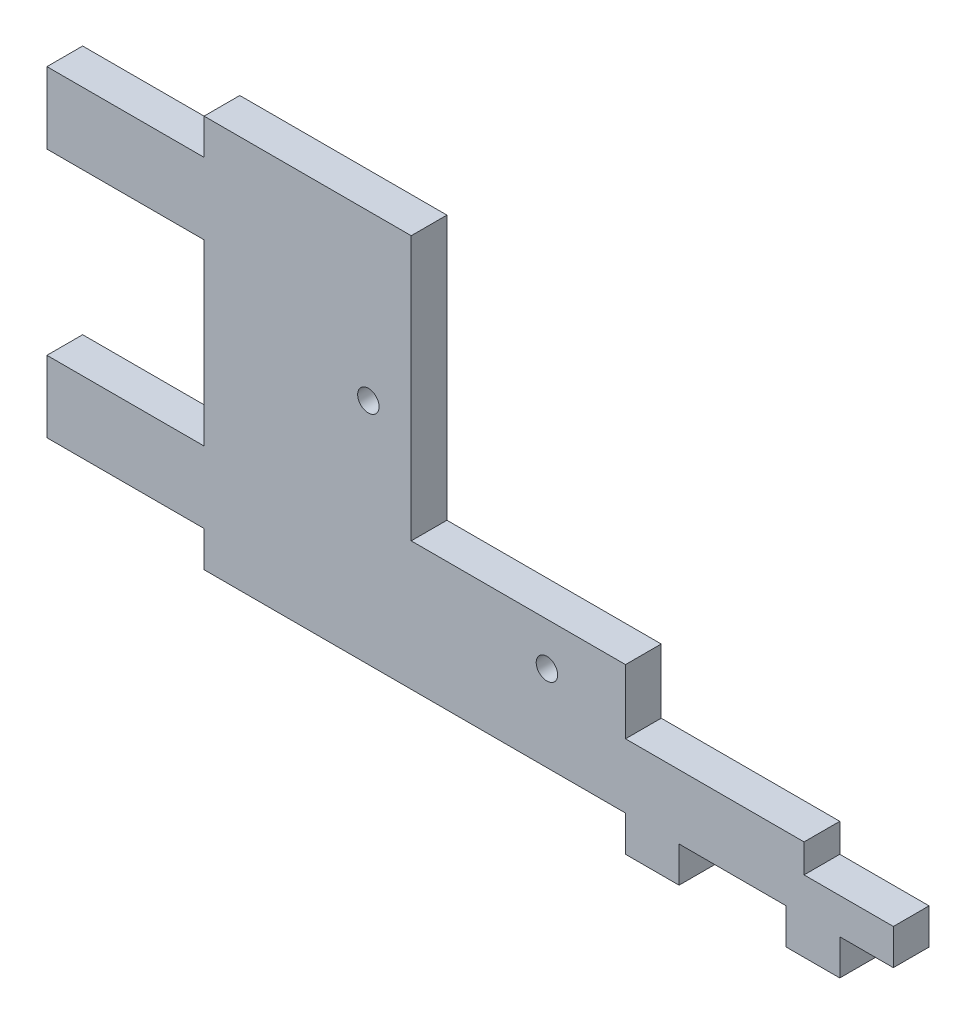
ISO-10303-21;
HEADER;
FILE_DESCRIPTION(('STEP AP214'),'2;1');
FILE_NAME('part.step','',(''),(''),'','','');
FILE_SCHEMA(('AUTOMOTIVE_DESIGN { 1 0 10303 214 1 1 1 1 }'));
ENDSEC;
DATA;
#1=APPLICATION_CONTEXT('core data for automotive mechanical design processes');
#2=APPLICATION_PROTOCOL_DEFINITION('international standard','automotive_design',2000,#1);
#3=PRODUCT_CONTEXT('',#1,'mechanical');
#4=PRODUCT('Part','Part','',(#3));
#5=PRODUCT_RELATED_PRODUCT_CATEGORY('part','',(#4));
#6=PRODUCT_DEFINITION_FORMATION('','',#4);
#7=PRODUCT_DEFINITION_CONTEXT('part definition',#1,'design');
#8=PRODUCT_DEFINITION('design','',#6,#7);
#9=PRODUCT_DEFINITION_SHAPE('','',#8);
#10=(LENGTH_UNIT() NAMED_UNIT(*) SI_UNIT(.MILLI.,.METRE.));
#11=(NAMED_UNIT(*) PLANE_ANGLE_UNIT() SI_UNIT($,.RADIAN.));
#12=(NAMED_UNIT(*) SI_UNIT($,.STERADIAN.) SOLID_ANGLE_UNIT());
#13=UNCERTAINTY_MEASURE_WITH_UNIT(LENGTH_MEASURE(1.E-05),#10,'distance_accuracy_value','');
#14=(GEOMETRIC_REPRESENTATION_CONTEXT(3) GLOBAL_UNCERTAINTY_ASSIGNED_CONTEXT((#13)) GLOBAL_UNIT_ASSIGNED_CONTEXT((#10,
#11,#12)) REPRESENTATION_CONTEXT('',''));
#15=CARTESIAN_POINT('',(0.,0.,0.));
#16=DIRECTION('',(0.,0.,1.));
#17=DIRECTION('',(1.,0.,0.));
#18=AXIS2_PLACEMENT_3D('',#15,#16,#17);
#19=CARTESIAN_POINT('',(0.,0.,5.));
#20=DIRECTION('',(0.,0.,-1.));
#21=DIRECTION('',(-1.,0.,0.));
#22=AXIS2_PLACEMENT_3D('',#19,#20,#21);
#23=PLANE('',#22);
#24=CARTESIAN_POINT('',(6.,32.,5.));
#25=DIRECTION('',(0.,0.,1.));
#26=DIRECTION('',(1.,0.,0.));
#27=AXIS2_PLACEMENT_3D('',#24,#25,#26);
#28=CIRCLE('',#27,1.5);
#29=CARTESIAN_POINT('',(7.5,32.,5.));
#30=VERTEX_POINT('',#29);
#31=EDGE_CURVE('E261',#30,#30,#28,.T.);
#32=ORIENTED_EDGE('',*,*,#31,.F.);
#33=EDGE_LOOP('',(#32));
#34=FACE_BOUND('',#33,.T.);
#35=DIRECTION('',(-1.,0.,0.));
#36=VECTOR('',#35,1.);
#37=CARTESIAN_POINT('',(0.,55.,5.));
#38=LINE('',#37,#36);
#39=CARTESIAN_POINT('',(12.,55.,5.));
#40=VERTEX_POINT('',#39);
#41=CARTESIAN_POINT('',(-17.,55.,5.));
#42=VERTEX_POINT('',#41);
#43=EDGE_CURVE('E271',#40,#42,#38,.T.);
#44=ORIENTED_EDGE('',*,*,#43,.T.);
#45=DIRECTION('',(0.,-1.,0.));
#46=VECTOR('',#45,1.);
#47=CARTESIAN_POINT('',(-17.,50.,5.));
#48=LINE('',#47,#46);
#49=CARTESIAN_POINT('',(-17.,50.,5.));
#50=VERTEX_POINT('',#49);
#51=EDGE_CURVE('E327',#42,#50,#48,.T.);
#52=ORIENTED_EDGE('',*,*,#51,.T.);
#53=DIRECTION('',(-1.,0.,0.));
#54=VECTOR('',#53,1.);
#55=CARTESIAN_POINT('',(-17.,50.,5.));
#56=LINE('',#55,#54);
#57=CARTESIAN_POINT('',(-39.,50.,5.));
#58=VERTEX_POINT('',#57);
#59=EDGE_CURVE('E330',#50,#58,#56,.T.);
#60=ORIENTED_EDGE('',*,*,#59,.T.);
#61=DIRECTION('',(0.,-1.,0.));
#62=VECTOR('',#61,1.);
#63=CARTESIAN_POINT('',(-39.,50.,5.));
#64=LINE('',#63,#62);
#65=CARTESIAN_POINT('',(-39.,40.,5.));
#66=VERTEX_POINT('',#65);
#67=EDGE_CURVE('E333',#58,#66,#64,.T.);
#68=ORIENTED_EDGE('',*,*,#67,.T.);
#69=DIRECTION('',(1.,0.,0.));
#70=VECTOR('',#69,1.);
#71=CARTESIAN_POINT('',(-17.,40.,5.));
#72=LINE('',#71,#70);
#73=CARTESIAN_POINT('',(-17.,40.,5.));
#74=VERTEX_POINT('',#73);
#75=EDGE_CURVE('E336',#66,#74,#72,.T.);
#76=ORIENTED_EDGE('',*,*,#75,.T.);
#77=DIRECTION('',(0.,-1.,0.));
#78=VECTOR('',#77,1.);
#79=CARTESIAN_POINT('',(-17.,15.,5.));
#80=LINE('',#79,#78);
#81=CARTESIAN_POINT('',(-17.,15.,5.));
#82=VERTEX_POINT('',#81);
#83=EDGE_CURVE('E339',#74,#82,#80,.T.);
#84=ORIENTED_EDGE('',*,*,#83,.T.);
#85=DIRECTION('',(-1.,0.,0.));
#86=VECTOR('',#85,1.);
#87=CARTESIAN_POINT('',(-17.,15.,5.));
#88=LINE('',#87,#86);
#89=CARTESIAN_POINT('',(-39.,15.,5.));
#90=VERTEX_POINT('',#89);
#91=EDGE_CURVE('E342',#82,#90,#88,.T.);
#92=ORIENTED_EDGE('',*,*,#91,.T.);
#93=DIRECTION('',(0.,-1.,0.));
#94=VECTOR('',#93,1.);
#95=CARTESIAN_POINT('',(-39.,5.00000000000001,5.));
#96=LINE('',#95,#94);
#97=CARTESIAN_POINT('',(-39.,5.00000000000001,5.));
#98=VERTEX_POINT('',#97);
#99=EDGE_CURVE('E345',#90,#98,#96,.T.);
#100=ORIENTED_EDGE('',*,*,#99,.T.);
#101=DIRECTION('',(1.,0.,0.));
#102=VECTOR('',#101,1.);
#103=CARTESIAN_POINT('',(-17.,4.99999999999999,5.));
#104=LINE('',#103,#102);
#105=CARTESIAN_POINT('',(-17.,4.99999999999999,5.));
#106=VERTEX_POINT('',#105);
#107=EDGE_CURVE('E303',#98,#106,#104,.T.);
#108=ORIENTED_EDGE('',*,*,#107,.T.);
#109=DIRECTION('',(0.,-1.,0.));
#110=VECTOR('',#109,1.);
#111=CARTESIAN_POINT('',(-17.,0.,5.));
#112=LINE('',#111,#110);
#113=CARTESIAN_POINT('',(-17.,0.,5.));
#114=VERTEX_POINT('',#113);
#115=EDGE_CURVE('E298',#106,#114,#112,.T.);
#116=ORIENTED_EDGE('',*,*,#115,.T.);
#117=DIRECTION('',(1.,0.,0.));
#118=VECTOR('',#117,1.);
#119=CARTESIAN_POINT('',(0.,0.,5.));
#120=LINE('',#119,#118);
#121=CARTESIAN_POINT('',(42.,0.,5.));
#122=VERTEX_POINT('',#121);
#123=EDGE_CURVE('E266',#114,#122,#120,.T.);
#124=ORIENTED_EDGE('',*,*,#123,.T.);
#125=DIRECTION('',(0.,-1.,0.));
#126=VECTOR('',#125,1.);
#127=CARTESIAN_POINT('',(42.,0.,5.));
#128=LINE('',#127,#126);
#129=CARTESIAN_POINT('',(42.,-5.,5.));
#130=VERTEX_POINT('',#129);
#131=EDGE_CURVE('E193',#122,#130,#128,.T.);
#132=ORIENTED_EDGE('',*,*,#131,.T.);
#133=DIRECTION('',(1.,0.,0.));
#134=VECTOR('',#133,1.);
#135=CARTESIAN_POINT('',(49.5,-5.,5.));
#136=LINE('',#135,#134);
#137=CARTESIAN_POINT('',(49.5,-5.,5.));
#138=VERTEX_POINT('',#137);
#139=EDGE_CURVE('E196',#130,#138,#136,.T.);
#140=ORIENTED_EDGE('',*,*,#139,.T.);
#141=DIRECTION('',(0.,1.,0.));
#142=VECTOR('',#141,1.);
#143=CARTESIAN_POINT('',(49.5,0.,5.));
#144=LINE('',#143,#142);
#145=CARTESIAN_POINT('',(49.5,0.,5.));
#146=VERTEX_POINT('',#145);
#147=EDGE_CURVE('E200',#138,#146,#144,.T.);
#148=ORIENTED_EDGE('',*,*,#147,.T.);
#149=DIRECTION('',(1.,0.,0.));
#150=VECTOR('',#149,1.);
#151=CARTESIAN_POINT('',(49.5,0.,5.));
#152=LINE('',#151,#150);
#153=CARTESIAN_POINT('',(64.5,0.,5.));
#154=VERTEX_POINT('',#153);
#155=EDGE_CURVE('E203',#146,#154,#152,.T.);
#156=ORIENTED_EDGE('',*,*,#155,.T.);
#157=DIRECTION('',(0.,-1.,0.));
#158=VECTOR('',#157,1.);
#159=CARTESIAN_POINT('',(64.5,0.,5.));
#160=LINE('',#159,#158);
#161=CARTESIAN_POINT('',(64.5,-5.,5.));
#162=VERTEX_POINT('',#161);
#163=EDGE_CURVE('E206',#154,#162,#160,.T.);
#164=ORIENTED_EDGE('',*,*,#163,.T.);
#165=DIRECTION('',(1.,0.,0.));
#166=VECTOR('',#165,1.);
#167=CARTESIAN_POINT('',(72.,-5.,5.));
#168=LINE('',#167,#166);
#169=CARTESIAN_POINT('',(72.,-5.,5.));
#170=VERTEX_POINT('',#169);
#171=EDGE_CURVE('E209',#162,#170,#168,.T.);
#172=ORIENTED_EDGE('',*,*,#171,.T.);
#173=DIRECTION('',(0.,1.,0.));
#174=VECTOR('',#173,1.);
#175=CARTESIAN_POINT('',(72.,0.,5.));
#176=LINE('',#175,#174);
#177=CARTESIAN_POINT('',(72.,0.,5.));
#178=VERTEX_POINT('',#177);
#179=EDGE_CURVE('E212',#170,#178,#176,.T.);
#180=ORIENTED_EDGE('',*,*,#179,.T.);
#181=DIRECTION('',(1.,0.,0.));
#182=VECTOR('',#181,1.);
#183=CARTESIAN_POINT('',(72.,0.,5.));
#184=LINE('',#183,#182);
#185=CARTESIAN_POINT('',(79.5,0.,5.));
#186=VERTEX_POINT('',#185);
#187=EDGE_CURVE('E215',#178,#186,#184,.T.);
#188=ORIENTED_EDGE('',*,*,#187,.T.);
#189=DIRECTION('',(0.,1.,0.));
#190=VECTOR('',#189,1.);
#191=CARTESIAN_POINT('',(79.5,5.,5.));
#192=LINE('',#191,#190);
#193=CARTESIAN_POINT('',(79.5,5.,5.));
#194=VERTEX_POINT('',#193);
#195=EDGE_CURVE('E218',#186,#194,#192,.T.);
#196=ORIENTED_EDGE('',*,*,#195,.T.);
#197=DIRECTION('',(-1.,0.,0.));
#198=VECTOR('',#197,1.);
#199=CARTESIAN_POINT('',(67.,5.,5.));
#200=LINE('',#199,#198);
#201=CARTESIAN_POINT('',(67.,5.,5.));
#202=VERTEX_POINT('',#201);
#203=EDGE_CURVE('E221',#194,#202,#200,.T.);
#204=ORIENTED_EDGE('',*,*,#203,.T.);
#205=DIRECTION('',(0.,1.,0.));
#206=VECTOR('',#205,1.);
#207=CARTESIAN_POINT('',(67.,9.00000000000001,5.));
#208=LINE('',#207,#206);
#209=CARTESIAN_POINT('',(67.,9.00000000000001,5.));
#210=VERTEX_POINT('',#209);
#211=EDGE_CURVE('E224',#202,#210,#208,.T.);
#212=ORIENTED_EDGE('',*,*,#211,.T.);
#213=DIRECTION('',(-1.,0.,0.));
#214=VECTOR('',#213,1.);
#215=CARTESIAN_POINT('',(42.,9.,5.));
#216=LINE('',#215,#214);
#217=CARTESIAN_POINT('',(42.,9.,5.));
#218=VERTEX_POINT('',#217);
#219=EDGE_CURVE('E167',#210,#218,#216,.T.);
#220=ORIENTED_EDGE('',*,*,#219,.T.);
#221=DIRECTION('',(0.,1.,0.));
#222=VECTOR('',#221,1.);
#223=CARTESIAN_POINT('',(42.,18.,5.));
#224=LINE('',#223,#222);
#225=CARTESIAN_POINT('',(42.,18.,5.));
#226=VERTEX_POINT('',#225);
#227=EDGE_CURVE('E227',#218,#226,#224,.T.);
#228=ORIENTED_EDGE('',*,*,#227,.T.);
#229=DIRECTION('',(-1.,0.,0.));
#230=VECTOR('',#229,1.);
#231=CARTESIAN_POINT('',(12.,18.,5.));
#232=LINE('',#231,#230);
#233=CARTESIAN_POINT('',(12.,18.,5.));
#234=VERTEX_POINT('',#233);
#235=EDGE_CURVE('E115',#226,#234,#232,.T.);
#236=ORIENTED_EDGE('',*,*,#235,.T.);
#237=DIRECTION('',(0.,1.,0.));
#238=VECTOR('',#237,1.);
#239=CARTESIAN_POINT('',(12.,55.,5.));
#240=LINE('',#239,#238);
#241=EDGE_CURVE('E50',#234,#40,#240,.T.);
#242=ORIENTED_EDGE('',*,*,#241,.T.);
#243=EDGE_LOOP('',(#44,#52,#60,#68,#76,#84,#92,#100,#108,#116,#124,#132,#140,#148,#156,#164,
#172,#180,#188,#196,#204,#212,#220,#228,#236,#242));
#244=FACE_BOUND('',#243,.T.);
#245=CARTESIAN_POINT('',(31.,12.,5.));
#246=DIRECTION('',(0.,0.,1.));
#247=DIRECTION('',(1.,0.,0.));
#248=AXIS2_PLACEMENT_3D('',#245,#246,#247);
#249=CIRCLE('',#248,1.5);
#250=CARTESIAN_POINT('',(32.5,12.,5.));
#251=VERTEX_POINT('',#250);
#252=EDGE_CURVE('E255',#251,#251,#249,.T.);
#253=ORIENTED_EDGE('',*,*,#252,.F.);
#254=EDGE_LOOP('',(#253));
#255=FACE_BOUND('',#254,.T.);
#256=ADVANCED_FACE('F33',(#34,#244,#255),#23,.F.);
#257=CARTESIAN_POINT('',(0.,0.,0.));
#258=DIRECTION('',(0.,0.,-1.));
#259=DIRECTION('',(-1.,0.,0.));
#260=AXIS2_PLACEMENT_3D('',#257,#258,#259);
#261=PLANE('',#260);
#262=CARTESIAN_POINT('',(6.,32.,0.));
#263=DIRECTION('',(0.,0.,1.));
#264=DIRECTION('',(1.,0.,0.));
#265=AXIS2_PLACEMENT_3D('',#262,#263,#264);
#266=CIRCLE('',#265,1.5);
#267=CARTESIAN_POINT('',(7.5,32.,0.));
#268=VERTEX_POINT('',#267);
#269=EDGE_CURVE('E258',#268,#268,#266,.T.);
#270=ORIENTED_EDGE('',*,*,#269,.T.);
#271=EDGE_LOOP('',(#270));
#272=FACE_BOUND('',#271,.T.);
#273=DIRECTION('',(1.,0.,0.));
#274=VECTOR('',#273,1.);
#275=CARTESIAN_POINT('',(0.,0.,0.));
#276=LINE('',#275,#274);
#277=CARTESIAN_POINT('',(-17.,0.,0.));
#278=VERTEX_POINT('',#277);
#279=CARTESIAN_POINT('',(42.,0.,0.));
#280=VERTEX_POINT('',#279);
#281=EDGE_CURVE('E124',#278,#280,#276,.T.);
#282=ORIENTED_EDGE('',*,*,#281,.F.);
#283=DIRECTION('',(0.,-1.,0.));
#284=VECTOR('',#283,1.);
#285=CARTESIAN_POINT('',(-17.,0.,0.));
#286=LINE('',#285,#284);
#287=CARTESIAN_POINT('',(-17.,4.99999999999999,0.));
#288=VERTEX_POINT('',#287);
#289=EDGE_CURVE('E323',#288,#278,#286,.T.);
#290=ORIENTED_EDGE('',*,*,#289,.F.);
#291=DIRECTION('',(1.,0.,0.));
#292=VECTOR('',#291,1.);
#293=CARTESIAN_POINT('',(-17.,4.99999999999999,0.));
#294=LINE('',#293,#292);
#295=CARTESIAN_POINT('',(-39.,5.00000000000001,0.));
#296=VERTEX_POINT('',#295);
#297=EDGE_CURVE('E320',#296,#288,#294,.T.);
#298=ORIENTED_EDGE('',*,*,#297,.F.);
#299=DIRECTION('',(0.,-1.,0.));
#300=VECTOR('',#299,1.);
#301=CARTESIAN_POINT('',(-39.,5.00000000000001,0.));
#302=LINE('',#301,#300);
#303=CARTESIAN_POINT('',(-39.,15.,0.));
#304=VERTEX_POINT('',#303);
#305=EDGE_CURVE('E317',#304,#296,#302,.T.);
#306=ORIENTED_EDGE('',*,*,#305,.F.);
#307=DIRECTION('',(-1.,0.,0.));
#308=VECTOR('',#307,1.);
#309=CARTESIAN_POINT('',(-17.,15.,0.));
#310=LINE('',#309,#308);
#311=CARTESIAN_POINT('',(-17.,15.,0.));
#312=VERTEX_POINT('',#311);
#313=EDGE_CURVE('E314',#312,#304,#310,.T.);
#314=ORIENTED_EDGE('',*,*,#313,.F.);
#315=DIRECTION('',(0.,-1.,0.));
#316=VECTOR('',#315,1.);
#317=CARTESIAN_POINT('',(-17.,15.,0.));
#318=LINE('',#317,#316);
#319=CARTESIAN_POINT('',(-17.,40.,0.));
#320=VERTEX_POINT('',#319);
#321=EDGE_CURVE('E311',#320,#312,#318,.T.);
#322=ORIENTED_EDGE('',*,*,#321,.F.);
#323=DIRECTION('',(1.,0.,0.));
#324=VECTOR('',#323,1.);
#325=CARTESIAN_POINT('',(-17.,40.,0.));
#326=LINE('',#325,#324);
#327=CARTESIAN_POINT('',(-39.,40.,0.));
#328=VERTEX_POINT('',#327);
#329=EDGE_CURVE('E308',#328,#320,#326,.T.);
#330=ORIENTED_EDGE('',*,*,#329,.F.);
#331=DIRECTION('',(0.,-1.,0.));
#332=VECTOR('',#331,1.);
#333=CARTESIAN_POINT('',(-39.,50.,0.));
#334=LINE('',#333,#332);
#335=CARTESIAN_POINT('',(-39.,50.,0.));
#336=VERTEX_POINT('',#335);
#337=EDGE_CURVE('E300',#336,#328,#334,.T.);
#338=ORIENTED_EDGE('',*,*,#337,.F.);
#339=DIRECTION('',(-1.,0.,0.));
#340=VECTOR('',#339,1.);
#341=CARTESIAN_POINT('',(-17.,50.,0.));
#342=LINE('',#341,#340);
#343=CARTESIAN_POINT('',(-17.,50.,0.));
#344=VERTEX_POINT('',#343);
#345=EDGE_CURVE('E294',#344,#336,#342,.T.);
#346=ORIENTED_EDGE('',*,*,#345,.F.);
#347=DIRECTION('',(0.,-1.,0.));
#348=VECTOR('',#347,1.);
#349=CARTESIAN_POINT('',(-17.,50.,0.));
#350=LINE('',#349,#348);
#351=CARTESIAN_POINT('',(-17.,55.,0.));
#352=VERTEX_POINT('',#351);
#353=EDGE_CURVE('E290',#352,#344,#350,.T.);
#354=ORIENTED_EDGE('',*,*,#353,.F.);
#355=DIRECTION('',(-1.,0.,0.));
#356=VECTOR('',#355,1.);
#357=CARTESIAN_POINT('',(0.,55.,0.));
#358=LINE('',#357,#356);
#359=CARTESIAN_POINT('',(12.,55.,0.));
#360=VERTEX_POINT('',#359);
#361=EDGE_CURVE('E268',#360,#352,#358,.T.);
#362=ORIENTED_EDGE('',*,*,#361,.F.);
#363=DIRECTION('',(0.,1.,0.));
#364=VECTOR('',#363,1.);
#365=CARTESIAN_POINT('',(12.,55.,0.));
#366=LINE('',#365,#364);
#367=CARTESIAN_POINT('',(12.,18.,0.));
#368=VERTEX_POINT('',#367);
#369=EDGE_CURVE('E275',#368,#360,#366,.T.);
#370=ORIENTED_EDGE('',*,*,#369,.F.);
#371=DIRECTION('',(-1.,0.,0.));
#372=VECTOR('',#371,1.);
#373=CARTESIAN_POINT('',(12.,18.,0.));
#374=LINE('',#373,#372);
#375=CARTESIAN_POINT('',(42.,18.,0.));
#376=VERTEX_POINT('',#375);
#377=EDGE_CURVE('E61',#376,#368,#374,.T.);
#378=ORIENTED_EDGE('',*,*,#377,.F.);
#379=DIRECTION('',(0.,1.,0.));
#380=VECTOR('',#379,1.);
#381=CARTESIAN_POINT('',(42.,18.,0.));
#382=LINE('',#381,#380);
#383=CARTESIAN_POINT('',(42.,9.,0.));
#384=VERTEX_POINT('',#383);
#385=EDGE_CURVE('E182',#384,#376,#382,.T.);
#386=ORIENTED_EDGE('',*,*,#385,.F.);
#387=DIRECTION('',(-1.,0.,0.));
#388=VECTOR('',#387,1.);
#389=CARTESIAN_POINT('',(42.,9.,0.));
#390=LINE('',#389,#388);
#391=CARTESIAN_POINT('',(67.,9.00000000000001,0.));
#392=VERTEX_POINT('',#391);
#393=EDGE_CURVE('E165',#392,#384,#390,.T.);
#394=ORIENTED_EDGE('',*,*,#393,.F.);
#395=DIRECTION('',(0.,1.,0.));
#396=VECTOR('',#395,1.);
#397=CARTESIAN_POINT('',(67.,9.00000000000001,0.));
#398=LINE('',#397,#396);
#399=CARTESIAN_POINT('',(67.,5.,0.));
#400=VERTEX_POINT('',#399);
#401=EDGE_CURVE('E179',#400,#392,#398,.T.);
#402=ORIENTED_EDGE('',*,*,#401,.F.);
#403=DIRECTION('',(-1.,0.,0.));
#404=VECTOR('',#403,1.);
#405=CARTESIAN_POINT('',(67.,5.,0.));
#406=LINE('',#405,#404);
#407=CARTESIAN_POINT('',(79.5,5.,0.));
#408=VERTEX_POINT('',#407);
#409=EDGE_CURVE('E185',#408,#400,#406,.T.);
#410=ORIENTED_EDGE('',*,*,#409,.F.);
#411=DIRECTION('',(0.,1.,0.));
#412=VECTOR('',#411,1.);
#413=CARTESIAN_POINT('',(79.5,5.,0.));
#414=LINE('',#413,#412);
#415=CARTESIAN_POINT('',(79.5,0.,0.));
#416=VERTEX_POINT('',#415);
#417=EDGE_CURVE('E187',#416,#408,#414,.T.);
#418=ORIENTED_EDGE('',*,*,#417,.F.);
#419=DIRECTION('',(1.,0.,0.));
#420=VECTOR('',#419,1.);
#421=CARTESIAN_POINT('',(72.,0.,0.));
#422=LINE('',#421,#420);
#423=CARTESIAN_POINT('',(72.,0.,0.));
#424=VERTEX_POINT('',#423);
#425=EDGE_CURVE('E396',#424,#416,#422,.T.);
#426=ORIENTED_EDGE('',*,*,#425,.F.);
#427=DIRECTION('',(0.,1.,0.));
#428=VECTOR('',#427,1.);
#429=CARTESIAN_POINT('',(72.,0.,0.));
#430=LINE('',#429,#428);
#431=CARTESIAN_POINT('',(72.,-5.,0.));
#432=VERTEX_POINT('',#431);
#433=EDGE_CURVE('E393',#432,#424,#430,.T.);
#434=ORIENTED_EDGE('',*,*,#433,.F.);
#435=DIRECTION('',(1.,0.,0.));
#436=VECTOR('',#435,1.);
#437=CARTESIAN_POINT('',(72.,-5.,0.));
#438=LINE('',#437,#436);
#439=CARTESIAN_POINT('',(64.5,-5.,0.));
#440=VERTEX_POINT('',#439);
#441=EDGE_CURVE('E390',#440,#432,#438,.T.);
#442=ORIENTED_EDGE('',*,*,#441,.F.);
#443=DIRECTION('',(0.,-1.,0.));
#444=VECTOR('',#443,1.);
#445=CARTESIAN_POINT('',(64.5,0.,0.));
#446=LINE('',#445,#444);
#447=CARTESIAN_POINT('',(64.5,0.,0.));
#448=VERTEX_POINT('',#447);
#449=EDGE_CURVE('E387',#448,#440,#446,.T.);
#450=ORIENTED_EDGE('',*,*,#449,.F.);
#451=DIRECTION('',(1.,0.,0.));
#452=VECTOR('',#451,1.);
#453=CARTESIAN_POINT('',(49.5,0.,0.));
#454=LINE('',#453,#452);
#455=CARTESIAN_POINT('',(49.5,0.,0.));
#456=VERTEX_POINT('',#455);
#457=EDGE_CURVE('E384',#456,#448,#454,.T.);
#458=ORIENTED_EDGE('',*,*,#457,.F.);
#459=DIRECTION('',(0.,1.,0.));
#460=VECTOR('',#459,1.);
#461=CARTESIAN_POINT('',(49.5,0.,0.));
#462=LINE('',#461,#460);
#463=CARTESIAN_POINT('',(49.5,-5.,0.));
#464=VERTEX_POINT('',#463);
#465=EDGE_CURVE('E381',#464,#456,#462,.T.);
#466=ORIENTED_EDGE('',*,*,#465,.F.);
#467=DIRECTION('',(1.,0.,0.));
#468=VECTOR('',#467,1.);
#469=CARTESIAN_POINT('',(49.5,-5.,0.));
#470=LINE('',#469,#468);
#471=CARTESIAN_POINT('',(42.,-5.,0.));
#472=VERTEX_POINT('',#471);
#473=EDGE_CURVE('E378',#472,#464,#470,.T.);
#474=ORIENTED_EDGE('',*,*,#473,.F.);
#475=DIRECTION('',(0.,-1.,0.));
#476=VECTOR('',#475,1.);
#477=CARTESIAN_POINT('',(42.,0.,0.));
#478=LINE('',#477,#476);
#479=EDGE_CURVE('E230',#280,#472,#478,.T.);
#480=ORIENTED_EDGE('',*,*,#479,.F.);
#481=EDGE_LOOP('',(#282,#290,#298,#306,#314,#322,#330,#338,#346,#354,#362,#370,#378,#386,#394,
#402,#410,#418,#426,#434,#442,#450,#458,#466,#474,#480));
#482=FACE_BOUND('',#481,.T.);
#483=CARTESIAN_POINT('',(31.,12.,0.));
#484=DIRECTION('',(0.,0.,1.));
#485=DIRECTION('',(1.,0.,0.));
#486=AXIS2_PLACEMENT_3D('',#483,#484,#485);
#487=CIRCLE('',#486,1.5);
#488=CARTESIAN_POINT('',(32.5,12.,0.));
#489=VERTEX_POINT('',#488);
#490=EDGE_CURVE('E233',#489,#489,#487,.T.);
#491=ORIENTED_EDGE('',*,*,#490,.T.);
#492=EDGE_LOOP('',(#491));
#493=FACE_BOUND('',#492,.T.);
#494=ADVANCED_FACE('F176',(#272,#482,#493),#261,.T.);
#495=CARTESIAN_POINT('',(0.,0.,5.));
#496=DIRECTION('',(0.,1.,0.));
#497=DIRECTION('',(0.,0.,1.));
#498=AXIS2_PLACEMENT_3D('',#495,#496,#497);
#499=PLANE('',#498);
#500=ORIENTED_EDGE('',*,*,#281,.T.);
#501=DIRECTION('',(0.,0.,1.));
#502=VECTOR('',#501,1.);
#503=CARTESIAN_POINT('',(42.,0.,0.));
#504=LINE('',#503,#502);
#505=EDGE_CURVE('E192',#280,#122,#504,.T.);
#506=ORIENTED_EDGE('',*,*,#505,.T.);
#507=ORIENTED_EDGE('',*,*,#123,.F.);
#508=DIRECTION('',(0.,0.,1.));
#509=VECTOR('',#508,1.);
#510=CARTESIAN_POINT('',(-17.,0.,0.));
#511=LINE('',#510,#509);
#512=EDGE_CURVE('E197',#278,#114,#511,.T.);
#513=ORIENTED_EDGE('',*,*,#512,.F.);
#514=EDGE_LOOP('',(#500,#506,#507,#513));
#515=FACE_BOUND('',#514,.T.);
#516=ADVANCED_FACE('F35',(#515),#499,.F.);
#517=CARTESIAN_POINT('',(12.,18.,5.));
#518=DIRECTION('',(0.,-1.,0.));
#519=DIRECTION('',(0.,0.,-1.));
#520=AXIS2_PLACEMENT_3D('',#517,#518,#519);
#521=PLANE('',#520);
#522=ORIENTED_EDGE('',*,*,#377,.T.);
#523=DIRECTION('',(0.,0.,-1.));
#524=VECTOR('',#523,1.);
#525=CARTESIAN_POINT('',(12.,18.,5.));
#526=LINE('',#525,#524);
#527=EDGE_CURVE('E11',#234,#368,#526,.T.);
#528=ORIENTED_EDGE('',*,*,#527,.F.);
#529=ORIENTED_EDGE('',*,*,#235,.F.);
#530=DIRECTION('',(0.,0.,1.));
#531=VECTOR('',#530,1.);
#532=CARTESIAN_POINT('',(42.,18.,0.));
#533=LINE('',#532,#531);
#534=EDGE_CURVE('E231',#376,#226,#533,.T.);
#535=ORIENTED_EDGE('',*,*,#534,.F.);
#536=EDGE_LOOP('',(#522,#528,#529,#535));
#537=FACE_BOUND('',#536,.T.);
#538=ADVANCED_FACE('F537',(#537),#521,.F.);
#539=CARTESIAN_POINT('',(12.,55.,5.));
#540=DIRECTION('',(-1.,0.,0.));
#541=DIRECTION('',(0.,-1.,0.));
#542=AXIS2_PLACEMENT_3D('',#539,#540,#541);
#543=PLANE('',#542);
#544=ORIENTED_EDGE('',*,*,#369,.T.);
#545=DIRECTION('',(0.,0.,-1.));
#546=VECTOR('',#545,1.);
#547=CARTESIAN_POINT('',(12.,55.,5.));
#548=LINE('',#547,#546);
#549=EDGE_CURVE('E42',#40,#360,#548,.T.);
#550=ORIENTED_EDGE('',*,*,#549,.F.);
#551=ORIENTED_EDGE('',*,*,#241,.F.);
#552=ORIENTED_EDGE('',*,*,#527,.T.);
#553=EDGE_LOOP('',(#544,#550,#551,#552));
#554=FACE_BOUND('',#553,.T.);
#555=ADVANCED_FACE('F535',(#554),#543,.F.);
#556=CARTESIAN_POINT('',(0.,55.,5.));
#557=DIRECTION('',(0.,-1.,0.));
#558=DIRECTION('',(0.,0.,-1.));
#559=AXIS2_PLACEMENT_3D('',#556,#557,#558);
#560=PLANE('',#559);
#561=ORIENTED_EDGE('',*,*,#361,.T.);
#562=DIRECTION('',(0.,0.,1.));
#563=VECTOR('',#562,1.);
#564=CARTESIAN_POINT('',(-17.,55.,0.));
#565=LINE('',#564,#563);
#566=EDGE_CURVE('E326',#352,#42,#565,.T.);
#567=ORIENTED_EDGE('',*,*,#566,.T.);
#568=ORIENTED_EDGE('',*,*,#43,.F.);
#569=ORIENTED_EDGE('',*,*,#549,.T.);
#570=EDGE_LOOP('',(#561,#567,#568,#569));
#571=FACE_BOUND('',#570,.T.);
#572=ADVANCED_FACE('F282',(#571),#560,.F.);
#573=CARTESIAN_POINT('',(6.,32.,5.));
#574=DIRECTION('',(0.,0.,-1.));
#575=DIRECTION('',(-1.,0.,0.));
#576=AXIS2_PLACEMENT_3D('',#573,#574,#575);
#577=CYLINDRICAL_SURFACE('',#576,1.5);
#578=ORIENTED_EDGE('',*,*,#31,.T.);
#579=EDGE_LOOP('',(#578));
#580=FACE_BOUND('',#579,.T.);
#581=ORIENTED_EDGE('',*,*,#269,.F.);
#582=EDGE_LOOP('',(#581));
#583=FACE_BOUND('',#582,.T.);
#584=ADVANCED_FACE('F530',(#580,#583),#577,.F.);
#585=CARTESIAN_POINT('',(31.,12.,5.));
#586=DIRECTION('',(0.,0.,-1.));
#587=DIRECTION('',(-1.,0.,0.));
#588=AXIS2_PLACEMENT_3D('',#585,#586,#587);
#589=CYLINDRICAL_SURFACE('',#588,1.5);
#590=ORIENTED_EDGE('',*,*,#252,.T.);
#591=EDGE_LOOP('',(#590));
#592=FACE_BOUND('',#591,.T.);
#593=ORIENTED_EDGE('',*,*,#490,.F.);
#594=EDGE_LOOP('',(#593));
#595=FACE_BOUND('',#594,.T.);
#596=ADVANCED_FACE('F560',(#592,#595),#589,.F.);
#597=CARTESIAN_POINT('',(42.,18.,0.));
#598=DIRECTION('',(1.,0.,0.));
#599=DIRECTION('',(0.,0.,-1.));
#600=AXIS2_PLACEMENT_3D('',#597,#598,#599);
#601=PLANE('',#600);
#602=ORIENTED_EDGE('',*,*,#227,.F.);
#603=DIRECTION('',(0.,0.,1.));
#604=VECTOR('',#603,1.);
#605=CARTESIAN_POINT('',(42.,9.,0.));
#606=LINE('',#605,#604);
#607=EDGE_CURVE('E172',#384,#218,#606,.T.);
#608=ORIENTED_EDGE('',*,*,#607,.F.);
#609=ORIENTED_EDGE('',*,*,#385,.T.);
#610=ORIENTED_EDGE('',*,*,#534,.T.);
#611=EDGE_LOOP('',(#602,#608,#609,#610));
#612=FACE_BOUND('',#611,.T.);
#613=ADVANCED_FACE('F564',(#612),#601,.T.);
#614=CARTESIAN_POINT('',(42.,9.,0.));
#615=DIRECTION('',(0.,1.,0.));
#616=DIRECTION('',(-1.,0.,0.));
#617=AXIS2_PLACEMENT_3D('',#614,#615,#616);
#618=PLANE('',#617);
#619=ORIENTED_EDGE('',*,*,#219,.F.);
#620=DIRECTION('',(0.,0.,1.));
#621=VECTOR('',#620,1.);
#622=CARTESIAN_POINT('',(67.,9.00000000000001,0.));
#623=LINE('',#622,#621);
#624=EDGE_CURVE('E162',#392,#210,#623,.T.);
#625=ORIENTED_EDGE('',*,*,#624,.F.);
#626=ORIENTED_EDGE('',*,*,#393,.T.);
#627=ORIENTED_EDGE('',*,*,#607,.T.);
#628=EDGE_LOOP('',(#619,#625,#626,#627));
#629=FACE_BOUND('',#628,.T.);
#630=ADVANCED_FACE('F164',(#629),#618,.T.);
#631=CARTESIAN_POINT('',(67.,9.00000000000001,0.));
#632=DIRECTION('',(1.,0.,0.));
#633=DIRECTION('',(0.,0.,-1.));
#634=AXIS2_PLACEMENT_3D('',#631,#632,#633);
#635=PLANE('',#634);
#636=ORIENTED_EDGE('',*,*,#211,.F.);
#637=DIRECTION('',(0.,0.,1.));
#638=VECTOR('',#637,1.);
#639=CARTESIAN_POINT('',(67.,5.,0.));
#640=LINE('',#639,#638);
#641=EDGE_CURVE('E173',#400,#202,#640,.T.);
#642=ORIENTED_EDGE('',*,*,#641,.F.);
#643=ORIENTED_EDGE('',*,*,#401,.T.);
#644=ORIENTED_EDGE('',*,*,#624,.T.);
#645=EDGE_LOOP('',(#636,#642,#643,#644));
#646=FACE_BOUND('',#645,.T.);
#647=ADVANCED_FACE('F184',(#646),#635,.T.);
#648=CARTESIAN_POINT('',(67.,5.,0.));
#649=DIRECTION('',(0.,1.,0.));
#650=DIRECTION('',(0.,0.,1.));
#651=AXIS2_PLACEMENT_3D('',#648,#649,#650);
#652=PLANE('',#651);
#653=ORIENTED_EDGE('',*,*,#203,.F.);
#654=DIRECTION('',(0.,0.,1.));
#655=VECTOR('',#654,1.);
#656=CARTESIAN_POINT('',(79.5,5.,0.));
#657=LINE('',#656,#655);
#658=EDGE_CURVE('E236',#408,#194,#657,.T.);
#659=ORIENTED_EDGE('',*,*,#658,.F.);
#660=ORIENTED_EDGE('',*,*,#409,.T.);
#661=ORIENTED_EDGE('',*,*,#641,.T.);
#662=EDGE_LOOP('',(#653,#659,#660,#661));
#663=FACE_BOUND('',#662,.T.);
#664=ADVANCED_FACE('F618',(#663),#652,.T.);
#665=CARTESIAN_POINT('',(79.5,5.,0.));
#666=DIRECTION('',(1.,0.,0.));
#667=DIRECTION('',(0.,0.,-1.));
#668=AXIS2_PLACEMENT_3D('',#665,#666,#667);
#669=PLANE('',#668);
#670=ORIENTED_EDGE('',*,*,#195,.F.);
#671=DIRECTION('',(0.,0.,1.));
#672=VECTOR('',#671,1.);
#673=CARTESIAN_POINT('',(79.5,0.,0.));
#674=LINE('',#673,#672);
#675=EDGE_CURVE('E238',#416,#186,#674,.T.);
#676=ORIENTED_EDGE('',*,*,#675,.F.);
#677=ORIENTED_EDGE('',*,*,#417,.T.);
#678=ORIENTED_EDGE('',*,*,#658,.T.);
#679=EDGE_LOOP('',(#670,#676,#677,#678));
#680=FACE_BOUND('',#679,.T.);
#681=ADVANCED_FACE('F402',(#680),#669,.T.);
#682=CARTESIAN_POINT('',(72.,0.,0.));
#683=DIRECTION('',(0.,-1.,0.));
#684=DIRECTION('',(1.,0.,0.));
#685=AXIS2_PLACEMENT_3D('',#682,#683,#684);
#686=PLANE('',#685);
#687=ORIENTED_EDGE('',*,*,#187,.F.);
#688=DIRECTION('',(0.,0.,1.));
#689=VECTOR('',#688,1.);
#690=CARTESIAN_POINT('',(72.,0.,0.));
#691=LINE('',#690,#689);
#692=EDGE_CURVE('E240',#424,#178,#691,.T.);
#693=ORIENTED_EDGE('',*,*,#692,.F.);
#694=ORIENTED_EDGE('',*,*,#425,.T.);
#695=ORIENTED_EDGE('',*,*,#675,.T.);
#696=EDGE_LOOP('',(#687,#693,#694,#695));
#697=FACE_BOUND('',#696,.T.);
#698=ADVANCED_FACE('F408',(#697),#686,.T.);
#699=CARTESIAN_POINT('',(72.,0.,0.));
#700=DIRECTION('',(1.,0.,0.));
#701=DIRECTION('',(0.,0.,-1.));
#702=AXIS2_PLACEMENT_3D('',#699,#700,#701);
#703=PLANE('',#702);
#704=ORIENTED_EDGE('',*,*,#179,.F.);
#705=DIRECTION('',(0.,0.,1.));
#706=VECTOR('',#705,1.);
#707=CARTESIAN_POINT('',(72.,-5.,0.));
#708=LINE('',#707,#706);
#709=EDGE_CURVE('E242',#432,#170,#708,.T.);
#710=ORIENTED_EDGE('',*,*,#709,.F.);
#711=ORIENTED_EDGE('',*,*,#433,.T.);
#712=ORIENTED_EDGE('',*,*,#692,.T.);
#713=EDGE_LOOP('',(#704,#710,#711,#712));
#714=FACE_BOUND('',#713,.T.);
#715=ADVANCED_FACE('F411',(#714),#703,.T.);
#716=CARTESIAN_POINT('',(72.,-5.,0.));
#717=DIRECTION('',(0.,-1.,0.));
#718=DIRECTION('',(1.,0.,0.));
#719=AXIS2_PLACEMENT_3D('',#716,#717,#718);
#720=PLANE('',#719);
#721=ORIENTED_EDGE('',*,*,#171,.F.);
#722=DIRECTION('',(0.,0.,1.));
#723=VECTOR('',#722,1.);
#724=CARTESIAN_POINT('',(64.5,-5.,0.));
#725=LINE('',#724,#723);
#726=EDGE_CURVE('E244',#440,#162,#725,.T.);
#727=ORIENTED_EDGE('',*,*,#726,.F.);
#728=ORIENTED_EDGE('',*,*,#441,.T.);
#729=ORIENTED_EDGE('',*,*,#709,.T.);
#730=EDGE_LOOP('',(#721,#727,#728,#729));
#731=FACE_BOUND('',#730,.T.);
#732=ADVANCED_FACE('F416',(#731),#720,.T.);
#733=CARTESIAN_POINT('',(64.5,0.,0.));
#734=DIRECTION('',(-1.,0.,0.));
#735=DIRECTION('',(0.,0.,1.));
#736=AXIS2_PLACEMENT_3D('',#733,#734,#735);
#737=PLANE('',#736);
#738=ORIENTED_EDGE('',*,*,#163,.F.);
#739=DIRECTION('',(0.,0.,1.));
#740=VECTOR('',#739,1.);
#741=CARTESIAN_POINT('',(64.5,0.,0.));
#742=LINE('',#741,#740);
#743=EDGE_CURVE('E246',#448,#154,#742,.T.);
#744=ORIENTED_EDGE('',*,*,#743,.F.);
#745=ORIENTED_EDGE('',*,*,#449,.T.);
#746=ORIENTED_EDGE('',*,*,#726,.T.);
#747=EDGE_LOOP('',(#738,#744,#745,#746));
#748=FACE_BOUND('',#747,.T.);
#749=ADVANCED_FACE('F419',(#748),#737,.T.);
#750=CARTESIAN_POINT('',(49.5,0.,0.));
#751=DIRECTION('',(0.,-1.,0.));
#752=DIRECTION('',(1.,0.,0.));
#753=AXIS2_PLACEMENT_3D('',#750,#751,#752);
#754=PLANE('',#753);
#755=ORIENTED_EDGE('',*,*,#155,.F.);
#756=DIRECTION('',(0.,0.,1.));
#757=VECTOR('',#756,1.);
#758=CARTESIAN_POINT('',(49.5,0.,0.));
#759=LINE('',#758,#757);
#760=EDGE_CURVE('E248',#456,#146,#759,.T.);
#761=ORIENTED_EDGE('',*,*,#760,.F.);
#762=ORIENTED_EDGE('',*,*,#457,.T.);
#763=ORIENTED_EDGE('',*,*,#743,.T.);
#764=EDGE_LOOP('',(#755,#761,#762,#763));
#765=FACE_BOUND('',#764,.T.);
#766=ADVANCED_FACE('F424',(#765),#754,.T.);
#767=CARTESIAN_POINT('',(49.5,0.,0.));
#768=DIRECTION('',(1.,0.,0.));
#769=DIRECTION('',(0.,0.,-1.));
#770=AXIS2_PLACEMENT_3D('',#767,#768,#769);
#771=PLANE('',#770);
#772=ORIENTED_EDGE('',*,*,#147,.F.);
#773=DIRECTION('',(0.,0.,1.));
#774=VECTOR('',#773,1.);
#775=CARTESIAN_POINT('',(49.5,-5.,0.));
#776=LINE('',#775,#774);
#777=EDGE_CURVE('E250',#464,#138,#776,.T.);
#778=ORIENTED_EDGE('',*,*,#777,.F.);
#779=ORIENTED_EDGE('',*,*,#465,.T.);
#780=ORIENTED_EDGE('',*,*,#760,.T.);
#781=EDGE_LOOP('',(#772,#778,#779,#780));
#782=FACE_BOUND('',#781,.T.);
#783=ADVANCED_FACE('F427',(#782),#771,.T.);
#784=CARTESIAN_POINT('',(49.5,-5.,0.));
#785=DIRECTION('',(0.,-1.,0.));
#786=DIRECTION('',(1.,0.,0.));
#787=AXIS2_PLACEMENT_3D('',#784,#785,#786);
#788=PLANE('',#787);
#789=ORIENTED_EDGE('',*,*,#139,.F.);
#790=DIRECTION('',(0.,0.,1.));
#791=VECTOR('',#790,1.);
#792=CARTESIAN_POINT('',(42.,-5.,0.));
#793=LINE('',#792,#791);
#794=EDGE_CURVE('E252',#472,#130,#793,.T.);
#795=ORIENTED_EDGE('',*,*,#794,.F.);
#796=ORIENTED_EDGE('',*,*,#473,.T.);
#797=ORIENTED_EDGE('',*,*,#777,.T.);
#798=EDGE_LOOP('',(#789,#795,#796,#797));
#799=FACE_BOUND('',#798,.T.);
#800=ADVANCED_FACE('F432',(#799),#788,.T.);
#801=CARTESIAN_POINT('',(42.,0.,0.));
#802=DIRECTION('',(-1.,0.,0.));
#803=DIRECTION('',(0.,0.,1.));
#804=AXIS2_PLACEMENT_3D('',#801,#802,#803);
#805=PLANE('',#804);
#806=ORIENTED_EDGE('',*,*,#131,.F.);
#807=ORIENTED_EDGE('',*,*,#505,.F.);
#808=ORIENTED_EDGE('',*,*,#479,.T.);
#809=ORIENTED_EDGE('',*,*,#794,.T.);
#810=EDGE_LOOP('',(#806,#807,#808,#809));
#811=FACE_BOUND('',#810,.T.);
#812=ADVANCED_FACE('F435',(#811),#805,.T.);
#813=CARTESIAN_POINT('',(-17.,0.,0.));
#814=DIRECTION('',(-1.,0.,0.));
#815=DIRECTION('',(0.,0.,1.));
#816=AXIS2_PLACEMENT_3D('',#813,#814,#815);
#817=PLANE('',#816);
#818=ORIENTED_EDGE('',*,*,#115,.F.);
#819=DIRECTION('',(0.,0.,1.));
#820=VECTOR('',#819,1.);
#821=CARTESIAN_POINT('',(-17.,4.99999999999999,0.));
#822=LINE('',#821,#820);
#823=EDGE_CURVE('E352',#288,#106,#822,.T.);
#824=ORIENTED_EDGE('',*,*,#823,.F.);
#825=ORIENTED_EDGE('',*,*,#289,.T.);
#826=ORIENTED_EDGE('',*,*,#512,.T.);
#827=EDGE_LOOP('',(#818,#824,#825,#826));
#828=FACE_BOUND('',#827,.T.);
#829=ADVANCED_FACE('F444',(#828),#817,.T.);
#830=CARTESIAN_POINT('',(-17.,4.99999999999999,0.));
#831=DIRECTION('',(0.,-1.,0.));
#832=DIRECTION('',(1.,0.,0.));
#833=AXIS2_PLACEMENT_3D('',#830,#831,#832);
#834=PLANE('',#833);
#835=ORIENTED_EDGE('',*,*,#107,.F.);
#836=DIRECTION('',(0.,0.,1.));
#837=VECTOR('',#836,1.);
#838=CARTESIAN_POINT('',(-39.,5.00000000000001,0.));
#839=LINE('',#838,#837);
#840=EDGE_CURVE('E355',#296,#98,#839,.T.);
#841=ORIENTED_EDGE('',*,*,#840,.F.);
#842=ORIENTED_EDGE('',*,*,#297,.T.);
#843=ORIENTED_EDGE('',*,*,#823,.T.);
#844=EDGE_LOOP('',(#835,#841,#842,#843));
#845=FACE_BOUND('',#844,.T.);
#846=ADVANCED_FACE('F450',(#845),#834,.T.);
#847=CARTESIAN_POINT('',(-39.,5.00000000000001,0.));
#848=DIRECTION('',(-1.,0.,0.));
#849=DIRECTION('',(0.,0.,1.));
#850=AXIS2_PLACEMENT_3D('',#847,#848,#849);
#851=PLANE('',#850);
#852=ORIENTED_EDGE('',*,*,#99,.F.);
#853=DIRECTION('',(0.,0.,1.));
#854=VECTOR('',#853,1.);
#855=CARTESIAN_POINT('',(-39.,15.,0.));
#856=LINE('',#855,#854);
#857=EDGE_CURVE('E358',#304,#90,#856,.T.);
#858=ORIENTED_EDGE('',*,*,#857,.F.);
#859=ORIENTED_EDGE('',*,*,#305,.T.);
#860=ORIENTED_EDGE('',*,*,#840,.T.);
#861=EDGE_LOOP('',(#852,#858,#859,#860));
#862=FACE_BOUND('',#861,.T.);
#863=ADVANCED_FACE('F510',(#862),#851,.T.);
#864=CARTESIAN_POINT('',(-17.,15.,0.));
#865=DIRECTION('',(0.,1.,0.));
#866=DIRECTION('',(-1.,0.,0.));
#867=AXIS2_PLACEMENT_3D('',#864,#865,#866);
#868=PLANE('',#867);
#869=ORIENTED_EDGE('',*,*,#91,.F.);
#870=DIRECTION('',(0.,0.,1.));
#871=VECTOR('',#870,1.);
#872=CARTESIAN_POINT('',(-17.,15.,0.));
#873=LINE('',#872,#871);
#874=EDGE_CURVE('E361',#312,#82,#873,.T.);
#875=ORIENTED_EDGE('',*,*,#874,.F.);
#876=ORIENTED_EDGE('',*,*,#313,.T.);
#877=ORIENTED_EDGE('',*,*,#857,.T.);
#878=EDGE_LOOP('',(#869,#875,#876,#877));
#879=FACE_BOUND('',#878,.T.);
#880=ADVANCED_FACE('F506',(#879),#868,.T.);
#881=CARTESIAN_POINT('',(-17.,15.,0.));
#882=DIRECTION('',(-1.,0.,0.));
#883=DIRECTION('',(0.,0.,1.));
#884=AXIS2_PLACEMENT_3D('',#881,#882,#883);
#885=PLANE('',#884);
#886=ORIENTED_EDGE('',*,*,#83,.F.);
#887=DIRECTION('',(0.,0.,1.));
#888=VECTOR('',#887,1.);
#889=CARTESIAN_POINT('',(-17.,40.,0.));
#890=LINE('',#889,#888);
#891=EDGE_CURVE('E364',#320,#74,#890,.T.);
#892=ORIENTED_EDGE('',*,*,#891,.F.);
#893=ORIENTED_EDGE('',*,*,#321,.T.);
#894=ORIENTED_EDGE('',*,*,#874,.T.);
#895=EDGE_LOOP('',(#886,#892,#893,#894));
#896=FACE_BOUND('',#895,.T.);
#897=ADVANCED_FACE('F502',(#896),#885,.T.);
#898=CARTESIAN_POINT('',(-17.,40.,0.));
#899=DIRECTION('',(0.,-1.,0.));
#900=DIRECTION('',(0.,0.,-1.));
#901=AXIS2_PLACEMENT_3D('',#898,#899,#900);
#902=PLANE('',#901);
#903=ORIENTED_EDGE('',*,*,#75,.F.);
#904=DIRECTION('',(0.,0.,1.));
#905=VECTOR('',#904,1.);
#906=CARTESIAN_POINT('',(-39.,40.,0.));
#907=LINE('',#906,#905);
#908=EDGE_CURVE('E367',#328,#66,#907,.T.);
#909=ORIENTED_EDGE('',*,*,#908,.F.);
#910=ORIENTED_EDGE('',*,*,#329,.T.);
#911=ORIENTED_EDGE('',*,*,#891,.T.);
#912=EDGE_LOOP('',(#903,#909,#910,#911));
#913=FACE_BOUND('',#912,.T.);
#914=ADVANCED_FACE('F498',(#913),#902,.T.);
#915=CARTESIAN_POINT('',(-39.,50.,0.));
#916=DIRECTION('',(-1.,0.,0.));
#917=DIRECTION('',(0.,0.,1.));
#918=AXIS2_PLACEMENT_3D('',#915,#916,#917);
#919=PLANE('',#918);
#920=ORIENTED_EDGE('',*,*,#67,.F.);
#921=DIRECTION('',(0.,0.,1.));
#922=VECTOR('',#921,1.);
#923=CARTESIAN_POINT('',(-39.,50.,0.));
#924=LINE('',#923,#922);
#925=EDGE_CURVE('E370',#336,#58,#924,.T.);
#926=ORIENTED_EDGE('',*,*,#925,.F.);
#927=ORIENTED_EDGE('',*,*,#337,.T.);
#928=ORIENTED_EDGE('',*,*,#908,.T.);
#929=EDGE_LOOP('',(#920,#926,#927,#928));
#930=FACE_BOUND('',#929,.T.);
#931=ADVANCED_FACE('F495',(#930),#919,.T.);
#932=CARTESIAN_POINT('',(-17.,50.,0.));
#933=DIRECTION('',(0.,1.,0.));
#934=DIRECTION('',(-1.,0.,0.));
#935=AXIS2_PLACEMENT_3D('',#932,#933,#934);
#936=PLANE('',#935);
#937=ORIENTED_EDGE('',*,*,#59,.F.);
#938=DIRECTION('',(0.,0.,1.));
#939=VECTOR('',#938,1.);
#940=CARTESIAN_POINT('',(-17.,50.,0.));
#941=LINE('',#940,#939);
#942=EDGE_CURVE('E373',#344,#50,#941,.T.);
#943=ORIENTED_EDGE('',*,*,#942,.F.);
#944=ORIENTED_EDGE('',*,*,#345,.T.);
#945=ORIENTED_EDGE('',*,*,#925,.T.);
#946=EDGE_LOOP('',(#937,#943,#944,#945));
#947=FACE_BOUND('',#946,.T.);
#948=ADVANCED_FACE('F488',(#947),#936,.T.);
#949=CARTESIAN_POINT('',(-17.,50.,0.));
#950=DIRECTION('',(-1.,0.,0.));
#951=DIRECTION('',(0.,0.,1.));
#952=AXIS2_PLACEMENT_3D('',#949,#950,#951);
#953=PLANE('',#952);
#954=ORIENTED_EDGE('',*,*,#51,.F.);
#955=ORIENTED_EDGE('',*,*,#566,.F.);
#956=ORIENTED_EDGE('',*,*,#353,.T.);
#957=ORIENTED_EDGE('',*,*,#942,.T.);
#958=EDGE_LOOP('',(#954,#955,#956,#957));
#959=FACE_BOUND('',#958,.T.);
#960=ADVANCED_FACE('F490',(#959),#953,.T.);
#961=CLOSED_SHELL('',(#256,#494,#516,#538,#555,#572,#584,#596,#613,#630,#647,#664,#681,#698,
#715,#732,#749,#766,#783,#800,#812,#829,#846,#863,#880,#897,#914,#931,#948,#960));
#962=MANIFOLD_SOLID_BREP('B2',#961);
#963=ADVANCED_BREP_SHAPE_REPRESENTATION('',(#18,#962),#14);
#964=SHAPE_DEFINITION_REPRESENTATION(#9,#963);
ENDSEC;
END-ISO-10303-21;
